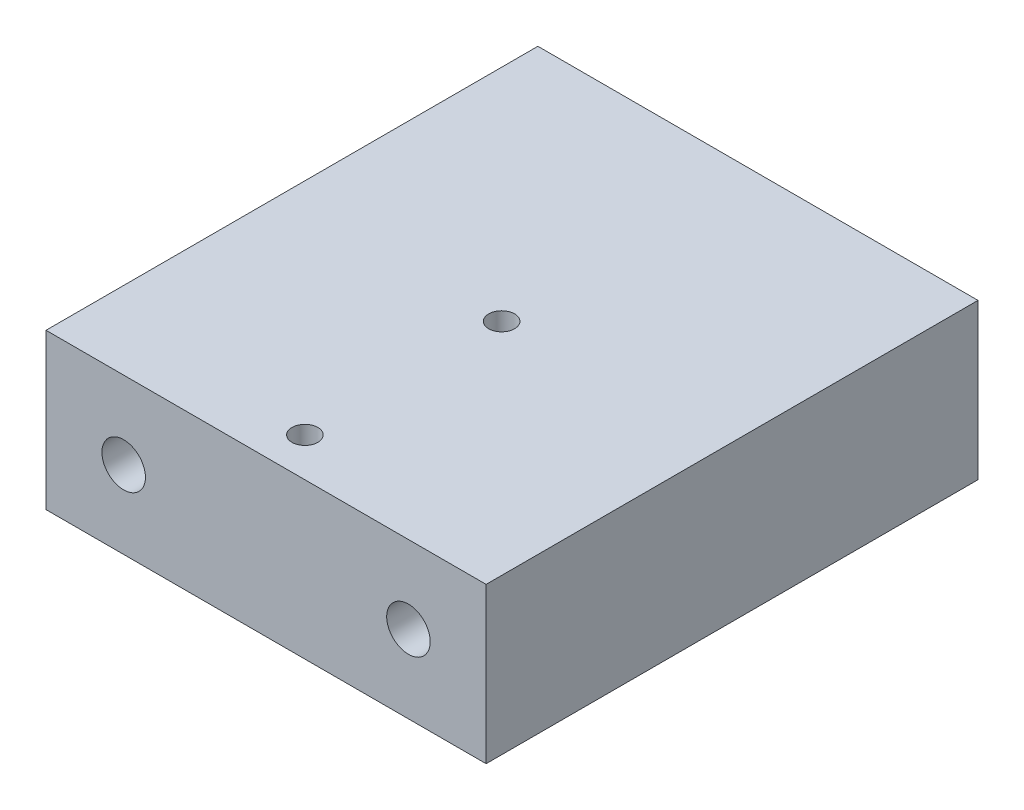
ISO-10303-21;
HEADER;
FILE_DESCRIPTION(('STEP AP214'),'2;1');
FILE_NAME('part.step','',(''),(''),'','','');
FILE_SCHEMA(('AUTOMOTIVE_DESIGN { 1 0 10303 214 1 1 1 1 }'));
ENDSEC;
DATA;
#1=APPLICATION_CONTEXT('core data for automotive mechanical design processes');
#2=APPLICATION_PROTOCOL_DEFINITION('international standard','automotive_design',2000,#1);
#3=PRODUCT_CONTEXT('',#1,'mechanical');
#4=PRODUCT('Part','Part','',(#3));
#5=PRODUCT_RELATED_PRODUCT_CATEGORY('part','',(#4));
#6=PRODUCT_DEFINITION_FORMATION('','',#4);
#7=PRODUCT_DEFINITION_CONTEXT('part definition',#1,'design');
#8=PRODUCT_DEFINITION('design','',#6,#7);
#9=PRODUCT_DEFINITION_SHAPE('','',#8);
#10=(LENGTH_UNIT() NAMED_UNIT(*) SI_UNIT(.MILLI.,.METRE.));
#11=(NAMED_UNIT(*) PLANE_ANGLE_UNIT() SI_UNIT($,.RADIAN.));
#12=(NAMED_UNIT(*) SI_UNIT($,.STERADIAN.) SOLID_ANGLE_UNIT());
#13=UNCERTAINTY_MEASURE_WITH_UNIT(LENGTH_MEASURE(1.E-05),#10,'distance_accuracy_value','');
#14=(GEOMETRIC_REPRESENTATION_CONTEXT(3) GLOBAL_UNCERTAINTY_ASSIGNED_CONTEXT((#13)) GLOBAL_UNIT_ASSIGNED_CONTEXT((#10,
#11,#12)) REPRESENTATION_CONTEXT('',''));
#15=CARTESIAN_POINT('',(0.,0.,0.));
#16=DIRECTION('',(0.,0.,1.));
#17=DIRECTION('',(1.,0.,0.));
#18=AXIS2_PLACEMENT_3D('',#15,#16,#17);
#19=CARTESIAN_POINT('',(0.,0.,47.5));
#20=DIRECTION('',(1.,0.,0.));
#21=DIRECTION('',(0.,0.,-1.));
#22=AXIS2_PLACEMENT_3D('',#19,#20,#21);
#23=PLANE('',#22);
#24=DIRECTION('',(0.,-1.,0.));
#25=VECTOR('',#24,1.);
#26=CARTESIAN_POINT('',(0.,0.,0.));
#27=LINE('',#26,#25);
#28=CARTESIAN_POINT('',(0.,15.,0.));
#29=VERTEX_POINT('',#28);
#30=CARTESIAN_POINT('',(0.,0.,0.));
#31=VERTEX_POINT('',#30);
#32=EDGE_CURVE('E184',#29,#31,#27,.T.);
#33=ORIENTED_EDGE('',*,*,#32,.T.);
#34=DIRECTION('',(0.,0.,-1.));
#35=VECTOR('',#34,1.);
#36=CARTESIAN_POINT('',(0.,0.,47.5));
#37=LINE('',#36,#35);
#38=CARTESIAN_POINT('',(0.,0.,47.5));
#39=VERTEX_POINT('',#38);
#40=EDGE_CURVE('E11',#39,#31,#37,.T.);
#41=ORIENTED_EDGE('',*,*,#40,.F.);
#42=DIRECTION('',(0.,-1.,0.));
#43=VECTOR('',#42,1.);
#44=CARTESIAN_POINT('',(0.,0.,47.5));
#45=LINE('',#44,#43);
#46=CARTESIAN_POINT('',(0.,15.,47.5));
#47=VERTEX_POINT('',#46);
#48=EDGE_CURVE('E185',#47,#39,#45,.T.);
#49=ORIENTED_EDGE('',*,*,#48,.F.);
#50=DIRECTION('',(0.,0.,-1.));
#51=VECTOR('',#50,1.);
#52=CARTESIAN_POINT('',(0.,15.,47.5));
#53=LINE('',#52,#51);
#54=EDGE_CURVE('E194',#47,#29,#53,.T.);
#55=ORIENTED_EDGE('',*,*,#54,.T.);
#56=EDGE_LOOP('',(#33,#41,#49,#55));
#57=FACE_BOUND('',#56,.T.);
#58=ADVANCED_FACE('F45',(#57),#23,.F.);
#59=CARTESIAN_POINT('',(0.,0.,47.5));
#60=DIRECTION('',(0.,1.,0.));
#61=DIRECTION('',(0.,0.,1.));
#62=AXIS2_PLACEMENT_3D('',#59,#60,#61);
#63=PLANE('',#62);
#64=DIRECTION('',(1.,0.,0.));
#65=VECTOR('',#64,1.);
#66=CARTESIAN_POINT('',(0.,0.,0.));
#67=LINE('',#66,#65);
#68=CARTESIAN_POINT('',(42.5,0.,0.));
#69=VERTEX_POINT('',#68);
#70=EDGE_CURVE('E198',#31,#69,#67,.T.);
#71=ORIENTED_EDGE('',*,*,#70,.T.);
#72=DIRECTION('',(0.,0.,-1.));
#73=VECTOR('',#72,1.);
#74=CARTESIAN_POINT('',(42.5,0.,47.5));
#75=LINE('',#74,#73);
#76=CARTESIAN_POINT('',(42.5,0.,47.5));
#77=VERTEX_POINT('',#76);
#78=EDGE_CURVE('E54',#77,#69,#75,.T.);
#79=ORIENTED_EDGE('',*,*,#78,.F.);
#80=DIRECTION('',(1.,0.,0.));
#81=VECTOR('',#80,1.);
#82=CARTESIAN_POINT('',(0.,0.,47.5));
#83=LINE('',#82,#81);
#84=EDGE_CURVE('E103',#39,#77,#83,.T.);
#85=ORIENTED_EDGE('',*,*,#84,.F.);
#86=ORIENTED_EDGE('',*,*,#40,.T.);
#87=EDGE_LOOP('',(#71,#79,#85,#86));
#88=FACE_BOUND('',#87,.T.);
#89=ADVANCED_FACE('F229',(#88),#63,.F.);
#90=CARTESIAN_POINT('',(42.5,0.,47.5));
#91=DIRECTION('',(-1.,0.,0.));
#92=DIRECTION('',(0.,0.,1.));
#93=AXIS2_PLACEMENT_3D('',#90,#91,#92);
#94=PLANE('',#93);
#95=DIRECTION('',(0.,1.,0.));
#96=VECTOR('',#95,1.);
#97=CARTESIAN_POINT('',(42.5,0.,0.));
#98=LINE('',#97,#96);
#99=CARTESIAN_POINT('',(42.5,15.,0.));
#100=VERTEX_POINT('',#99);
#101=EDGE_CURVE('E88',#69,#100,#98,.T.);
#102=ORIENTED_EDGE('',*,*,#101,.T.);
#103=DIRECTION('',(0.,0.,-1.));
#104=VECTOR('',#103,1.);
#105=CARTESIAN_POINT('',(42.5,15.,47.5));
#106=LINE('',#105,#104);
#107=CARTESIAN_POINT('',(42.5,15.,47.5));
#108=VERTEX_POINT('',#107);
#109=EDGE_CURVE('E207',#108,#100,#106,.T.);
#110=ORIENTED_EDGE('',*,*,#109,.F.);
#111=DIRECTION('',(0.,1.,0.));
#112=VECTOR('',#111,1.);
#113=CARTESIAN_POINT('',(42.5,0.,47.5));
#114=LINE('',#113,#112);
#115=EDGE_CURVE('E189',#77,#108,#114,.T.);
#116=ORIENTED_EDGE('',*,*,#115,.F.);
#117=ORIENTED_EDGE('',*,*,#78,.T.);
#118=EDGE_LOOP('',(#102,#110,#116,#117));
#119=FACE_BOUND('',#118,.T.);
#120=ADVANCED_FACE('F211',(#119),#94,.F.);
#121=CARTESIAN_POINT('',(0.,15.,47.5));
#122=DIRECTION('',(0.,-1.,0.));
#123=DIRECTION('',(0.,0.,-1.));
#124=AXIS2_PLACEMENT_3D('',#121,#122,#123);
#125=PLANE('',#124);
#126=CARTESIAN_POINT('',(21.25,15.,43.75));
#127=DIRECTION('',(0.,1.,0.));
#128=DIRECTION('',(0.,0.,1.));
#129=AXIS2_PLACEMENT_3D('',#126,#127,#128);
#130=CIRCLE('',#129,1.25);
#131=CARTESIAN_POINT('',(21.25,15.,45.));
#132=VERTEX_POINT('',#131);
#133=EDGE_CURVE('E138',#132,#132,#130,.T.);
#134=ORIENTED_EDGE('',*,*,#133,.F.);
#135=EDGE_LOOP('',(#134));
#136=FACE_BOUND('',#135,.T.);
#137=CARTESIAN_POINT('',(21.25,15.,24.75));
#138=DIRECTION('',(0.,1.,0.));
#139=DIRECTION('',(0.,0.,1.));
#140=AXIS2_PLACEMENT_3D('',#137,#138,#139);
#141=CIRCLE('',#140,1.25);
#142=CARTESIAN_POINT('',(21.25,15.,26.));
#143=VERTEX_POINT('',#142);
#144=EDGE_CURVE('E137',#143,#143,#141,.T.);
#145=ORIENTED_EDGE('',*,*,#144,.F.);
#146=EDGE_LOOP('',(#145));
#147=FACE_BOUND('',#146,.T.);
#148=DIRECTION('',(-1.,0.,0.));
#149=VECTOR('',#148,1.);
#150=CARTESIAN_POINT('',(0.,15.,0.));
#151=LINE('',#150,#149);
#152=EDGE_CURVE('E96',#100,#29,#151,.T.);
#153=ORIENTED_EDGE('',*,*,#152,.T.);
#154=ORIENTED_EDGE('',*,*,#54,.F.);
#155=DIRECTION('',(-1.,0.,0.));
#156=VECTOR('',#155,1.);
#157=CARTESIAN_POINT('',(0.,15.,47.5));
#158=LINE('',#157,#156);
#159=EDGE_CURVE('E65',#108,#47,#158,.T.);
#160=ORIENTED_EDGE('',*,*,#159,.F.);
#161=ORIENTED_EDGE('',*,*,#109,.T.);
#162=EDGE_LOOP('',(#153,#154,#160,#161));
#163=FACE_BOUND('',#162,.T.);
#164=ADVANCED_FACE('F218',(#136,#147,#163),#125,.F.);
#165=CARTESIAN_POINT('',(0.,0.,47.5));
#166=DIRECTION('',(0.,0.,-1.));
#167=DIRECTION('',(-1.,0.,0.));
#168=AXIS2_PLACEMENT_3D('',#165,#166,#167);
#169=PLANE('',#168);
#170=CARTESIAN_POINT('',(7.5,7.5,47.5));
#171=DIRECTION('',(0.,0.,1.));
#172=DIRECTION('',(1.,0.,0.));
#173=AXIS2_PLACEMENT_3D('',#170,#171,#172);
#174=CIRCLE('',#173,2.1);
#175=CARTESIAN_POINT('',(9.6,7.5,47.5));
#176=VERTEX_POINT('',#175);
#177=EDGE_CURVE('E153',#176,#176,#174,.T.);
#178=ORIENTED_EDGE('',*,*,#177,.F.);
#179=EDGE_LOOP('',(#178));
#180=FACE_BOUND('',#179,.T.);
#181=CARTESIAN_POINT('',(35.,7.5,47.5));
#182=DIRECTION('',(0.,0.,1.));
#183=DIRECTION('',(1.,0.,0.));
#184=AXIS2_PLACEMENT_3D('',#181,#182,#183);
#185=CIRCLE('',#184,2.1);
#186=CARTESIAN_POINT('',(37.1,7.5,47.5));
#187=VERTEX_POINT('',#186);
#188=EDGE_CURVE('E160',#187,#187,#185,.T.);
#189=ORIENTED_EDGE('',*,*,#188,.F.);
#190=EDGE_LOOP('',(#189));
#191=FACE_BOUND('',#190,.T.);
#192=ORIENTED_EDGE('',*,*,#48,.T.);
#193=ORIENTED_EDGE('',*,*,#84,.T.);
#194=ORIENTED_EDGE('',*,*,#115,.T.);
#195=ORIENTED_EDGE('',*,*,#159,.T.);
#196=EDGE_LOOP('',(#192,#193,#194,#195));
#197=FACE_BOUND('',#196,.T.);
#198=ADVANCED_FACE('F220',(#180,#191,#197),#169,.F.);
#199=CARTESIAN_POINT('',(0.,0.,0.));
#200=DIRECTION('',(0.,0.,-1.));
#201=DIRECTION('',(-1.,0.,0.));
#202=AXIS2_PLACEMENT_3D('',#199,#200,#201);
#203=PLANE('',#202);
#204=CARTESIAN_POINT('',(7.5,7.5,0.));
#205=DIRECTION('',(0.,0.,-1.));
#206=DIRECTION('',(-1.,0.,0.));
#207=AXIS2_PLACEMENT_3D('',#204,#205,#206);
#208=CIRCLE('',#207,2.1);
#209=CARTESIAN_POINT('',(5.4,7.5,0.));
#210=VERTEX_POINT('',#209);
#211=EDGE_CURVE('E168',#210,#210,#208,.T.);
#212=ORIENTED_EDGE('',*,*,#211,.F.);
#213=EDGE_LOOP('',(#212));
#214=FACE_BOUND('',#213,.T.);
#215=CARTESIAN_POINT('',(35.,7.5,0.));
#216=DIRECTION('',(0.,0.,-1.));
#217=DIRECTION('',(-1.,0.,0.));
#218=AXIS2_PLACEMENT_3D('',#215,#216,#217);
#219=CIRCLE('',#218,2.1);
#220=CARTESIAN_POINT('',(32.9,7.5,0.));
#221=VERTEX_POINT('',#220);
#222=EDGE_CURVE('E176',#221,#221,#219,.T.);
#223=ORIENTED_EDGE('',*,*,#222,.F.);
#224=EDGE_LOOP('',(#223));
#225=FACE_BOUND('',#224,.T.);
#226=ORIENTED_EDGE('',*,*,#32,.F.);
#227=ORIENTED_EDGE('',*,*,#152,.F.);
#228=ORIENTED_EDGE('',*,*,#101,.F.);
#229=ORIENTED_EDGE('',*,*,#70,.F.);
#230=EDGE_LOOP('',(#226,#227,#228,#229));
#231=FACE_BOUND('',#230,.T.);
#232=ADVANCED_FACE('F214',(#214,#225,#231),#203,.T.);
#233=CARTESIAN_POINT('',(35.,7.5,10.));
#234=DIRECTION('',(0.,0.,-1.));
#235=DIRECTION('',(-1.,0.,0.));
#236=AXIS2_PLACEMENT_3D('',#233,#234,#235);
#237=CONICAL_SURFACE('',#236,2.1,1.02974425867665);
#238=CARTESIAN_POINT('',(35.,7.5,11.2618072999579));
#239=VERTEX_POINT('',#238);
#240=VERTEX_LOOP('',#239);
#241=FACE_BOUND('',#240,.T.);
#242=CARTESIAN_POINT('',(35.,7.5,10.));
#243=DIRECTION('',(0.,0.,-1.));
#244=DIRECTION('',(-1.,0.,0.));
#245=AXIS2_PLACEMENT_3D('',#242,#243,#244);
#246=CIRCLE('',#245,2.1);
#247=CARTESIAN_POINT('',(32.9,7.5,10.));
#248=VERTEX_POINT('',#247);
#249=EDGE_CURVE('E180',#248,#248,#246,.T.);
#250=ORIENTED_EDGE('',*,*,#249,.T.);
#251=EDGE_LOOP('',(#250));
#252=FACE_BOUND('',#251,.T.);
#253=ADVANCED_FACE('F269',(#241,#252),#237,.F.);
#254=CARTESIAN_POINT('',(35.,7.5,0.));
#255=DIRECTION('',(0.,0.,-1.));
#256=DIRECTION('',(-1.,0.,0.));
#257=AXIS2_PLACEMENT_3D('',#254,#255,#256);
#258=CYLINDRICAL_SURFACE('',#257,2.1);
#259=ORIENTED_EDGE('',*,*,#249,.F.);
#260=EDGE_LOOP('',(#259));
#261=FACE_BOUND('',#260,.T.);
#262=ORIENTED_EDGE('',*,*,#222,.T.);
#263=EDGE_LOOP('',(#262));
#264=FACE_BOUND('',#263,.T.);
#265=ADVANCED_FACE('F335',(#261,#264),#258,.F.);
#266=CARTESIAN_POINT('',(7.5,7.5,10.));
#267=DIRECTION('',(0.,0.,-1.));
#268=DIRECTION('',(-1.,0.,0.));
#269=AXIS2_PLACEMENT_3D('',#266,#267,#268);
#270=CONICAL_SURFACE('',#269,2.1,1.02974425867665);
#271=CARTESIAN_POINT('',(7.5,7.5,11.2618072999579));
#272=VERTEX_POINT('',#271);
#273=VERTEX_LOOP('',#272);
#274=FACE_BOUND('',#273,.T.);
#275=CARTESIAN_POINT('',(7.5,7.5,10.));
#276=DIRECTION('',(0.,0.,-1.));
#277=DIRECTION('',(-1.,0.,0.));
#278=AXIS2_PLACEMENT_3D('',#275,#276,#277);
#279=CIRCLE('',#278,2.1);
#280=CARTESIAN_POINT('',(5.4,7.5,10.));
#281=VERTEX_POINT('',#280);
#282=EDGE_CURVE('E172',#281,#281,#279,.T.);
#283=ORIENTED_EDGE('',*,*,#282,.T.);
#284=EDGE_LOOP('',(#283));
#285=FACE_BOUND('',#284,.T.);
#286=ADVANCED_FACE('F325',(#274,#285),#270,.F.);
#287=CARTESIAN_POINT('',(7.5,7.5,0.));
#288=DIRECTION('',(0.,0.,-1.));
#289=DIRECTION('',(-1.,0.,0.));
#290=AXIS2_PLACEMENT_3D('',#287,#288,#289);
#291=CYLINDRICAL_SURFACE('',#290,2.1);
#292=ORIENTED_EDGE('',*,*,#282,.F.);
#293=EDGE_LOOP('',(#292));
#294=FACE_BOUND('',#293,.T.);
#295=ORIENTED_EDGE('',*,*,#211,.T.);
#296=EDGE_LOOP('',(#295));
#297=FACE_BOUND('',#296,.T.);
#298=ADVANCED_FACE('F281',(#294,#297),#291,.F.);
#299=CARTESIAN_POINT('',(35.,7.5,37.5));
#300=DIRECTION('',(0.,0.,1.));
#301=DIRECTION('',(1.,0.,0.));
#302=AXIS2_PLACEMENT_3D('',#299,#300,#301);
#303=CONICAL_SURFACE('',#302,2.1,1.02974425867665);
#304=CARTESIAN_POINT('',(35.,7.5,36.2381927000421));
#305=VERTEX_POINT('',#304);
#306=VERTEX_LOOP('',#305);
#307=FACE_BOUND('',#306,.T.);
#308=CARTESIAN_POINT('',(35.,7.5,37.5));
#309=DIRECTION('',(0.,0.,1.));
#310=DIRECTION('',(1.,0.,0.));
#311=AXIS2_PLACEMENT_3D('',#308,#309,#310);
#312=CIRCLE('',#311,2.1);
#313=CARTESIAN_POINT('',(37.1,7.5,37.5));
#314=VERTEX_POINT('',#313);
#315=EDGE_CURVE('E164',#314,#314,#312,.T.);
#316=ORIENTED_EDGE('',*,*,#315,.T.);
#317=EDGE_LOOP('',(#316));
#318=FACE_BOUND('',#317,.T.);
#319=ADVANCED_FACE('F276',(#307,#318),#303,.F.);
#320=CARTESIAN_POINT('',(35.,7.5,47.5));
#321=DIRECTION('',(0.,0.,1.));
#322=DIRECTION('',(1.,0.,0.));
#323=AXIS2_PLACEMENT_3D('',#320,#321,#322);
#324=CYLINDRICAL_SURFACE('',#323,2.1);
#325=ORIENTED_EDGE('',*,*,#315,.F.);
#326=EDGE_LOOP('',(#325));
#327=FACE_BOUND('',#326,.T.);
#328=ORIENTED_EDGE('',*,*,#188,.T.);
#329=EDGE_LOOP('',(#328));
#330=FACE_BOUND('',#329,.T.);
#331=ADVANCED_FACE('F280',(#327,#330),#324,.F.);
#332=CARTESIAN_POINT('',(7.5,7.5,37.5));
#333=DIRECTION('',(0.,0.,1.));
#334=DIRECTION('',(1.,0.,0.));
#335=AXIS2_PLACEMENT_3D('',#332,#333,#334);
#336=CONICAL_SURFACE('',#335,2.1,1.02974425867665);
#337=CARTESIAN_POINT('',(7.5,7.5,36.2381927000421));
#338=VERTEX_POINT('',#337);
#339=VERTEX_LOOP('',#338);
#340=FACE_BOUND('',#339,.T.);
#341=CARTESIAN_POINT('',(7.5,7.5,37.5));
#342=DIRECTION('',(0.,0.,1.));
#343=DIRECTION('',(1.,0.,0.));
#344=AXIS2_PLACEMENT_3D('',#341,#342,#343);
#345=CIRCLE('',#344,2.1);
#346=CARTESIAN_POINT('',(9.6,7.5,37.5));
#347=VERTEX_POINT('',#346);
#348=EDGE_CURVE('E156',#347,#347,#345,.T.);
#349=ORIENTED_EDGE('',*,*,#348,.T.);
#350=EDGE_LOOP('',(#349));
#351=FACE_BOUND('',#350,.T.);
#352=ADVANCED_FACE('F292',(#340,#351),#336,.F.);
#353=CARTESIAN_POINT('',(7.5,7.5,47.5));
#354=DIRECTION('',(0.,0.,1.));
#355=DIRECTION('',(1.,0.,0.));
#356=AXIS2_PLACEMENT_3D('',#353,#354,#355);
#357=CYLINDRICAL_SURFACE('',#356,2.1);
#358=ORIENTED_EDGE('',*,*,#348,.F.);
#359=EDGE_LOOP('',(#358));
#360=FACE_BOUND('',#359,.T.);
#361=ORIENTED_EDGE('',*,*,#177,.T.);
#362=EDGE_LOOP('',(#361));
#363=FACE_BOUND('',#362,.T.);
#364=ADVANCED_FACE('F302',(#360,#363),#357,.F.);
#365=CARTESIAN_POINT('',(21.25,6.5,24.75));
#366=DIRECTION('',(0.,1.,0.));
#367=DIRECTION('',(0.,0.,1.));
#368=AXIS2_PLACEMENT_3D('',#365,#366,#367);
#369=CONICAL_SURFACE('',#368,1.25,1.02974425867665);
#370=CARTESIAN_POINT('',(21.25,5.74892422621555,24.75));
#371=VERTEX_POINT('',#370);
#372=VERTEX_LOOP('',#371);
#373=FACE_BOUND('',#372,.T.);
#374=CARTESIAN_POINT('',(21.25,6.5,24.75));
#375=DIRECTION('',(0.,1.,0.));
#376=DIRECTION('',(0.,0.,1.));
#377=AXIS2_PLACEMENT_3D('',#374,#375,#376);
#378=CIRCLE('',#377,1.25);
#379=CARTESIAN_POINT('',(21.25,6.5,26.));
#380=VERTEX_POINT('',#379);
#381=EDGE_CURVE('E144',#380,#380,#378,.T.);
#382=ORIENTED_EDGE('',*,*,#381,.T.);
#383=EDGE_LOOP('',(#382));
#384=FACE_BOUND('',#383,.T.);
#385=ADVANCED_FACE('F260',(#373,#384),#369,.F.);
#386=CARTESIAN_POINT('',(21.25,15.,24.75));
#387=DIRECTION('',(0.,1.,0.));
#388=DIRECTION('',(0.,0.,1.));
#389=AXIS2_PLACEMENT_3D('',#386,#387,#388);
#390=CYLINDRICAL_SURFACE('',#389,1.25);
#391=ORIENTED_EDGE('',*,*,#381,.F.);
#392=EDGE_LOOP('',(#391));
#393=FACE_BOUND('',#392,.T.);
#394=ORIENTED_EDGE('',*,*,#144,.T.);
#395=EDGE_LOOP('',(#394));
#396=FACE_BOUND('',#395,.T.);
#397=ADVANCED_FACE('F130',(#393,#396),#390,.F.);
#398=CARTESIAN_POINT('',(21.25,6.5,43.75));
#399=DIRECTION('',(0.,1.,0.));
#400=DIRECTION('',(0.,0.,1.));
#401=AXIS2_PLACEMENT_3D('',#398,#399,#400);
#402=CONICAL_SURFACE('',#401,1.25,1.02974425867665);
#403=CARTESIAN_POINT('',(21.25,5.74892422621555,43.75));
#404=VERTEX_POINT('',#403);
#405=VERTEX_LOOP('',#404);
#406=FACE_BOUND('',#405,.T.);
#407=CARTESIAN_POINT('',(21.25,6.5,43.75));
#408=DIRECTION('',(0.,1.,0.));
#409=DIRECTION('',(0.,0.,1.));
#410=AXIS2_PLACEMENT_3D('',#407,#408,#409);
#411=CIRCLE('',#410,1.25);
#412=CARTESIAN_POINT('',(21.25,6.5,45.));
#413=VERTEX_POINT('',#412);
#414=EDGE_CURVE('E134',#413,#413,#411,.T.);
#415=ORIENTED_EDGE('',*,*,#414,.T.);
#416=EDGE_LOOP('',(#415));
#417=FACE_BOUND('',#416,.T.);
#418=ADVANCED_FACE('F126',(#406,#417),#402,.F.);
#419=CARTESIAN_POINT('',(21.25,15.,43.75));
#420=DIRECTION('',(0.,1.,0.));
#421=DIRECTION('',(0.,0.,1.));
#422=AXIS2_PLACEMENT_3D('',#419,#420,#421);
#423=CYLINDRICAL_SURFACE('',#422,1.25);
#424=ORIENTED_EDGE('',*,*,#414,.F.);
#425=EDGE_LOOP('',(#424));
#426=FACE_BOUND('',#425,.T.);
#427=ORIENTED_EDGE('',*,*,#133,.T.);
#428=EDGE_LOOP('',(#427));
#429=FACE_BOUND('',#428,.T.);
#430=ADVANCED_FACE('F129',(#426,#429),#423,.F.);
#431=CLOSED_SHELL('',(#58,#89,#120,#164,#198,#232,#253,#265,#286,#298,#319,#331,#352,#364,#385,
#397,#418,#430));
#432=MANIFOLD_SOLID_BREP('B2',#431);
#433=ADVANCED_BREP_SHAPE_REPRESENTATION('',(#18,#432),#14);
#434=SHAPE_DEFINITION_REPRESENTATION(#9,#433);
ENDSEC;
END-ISO-10303-21;
